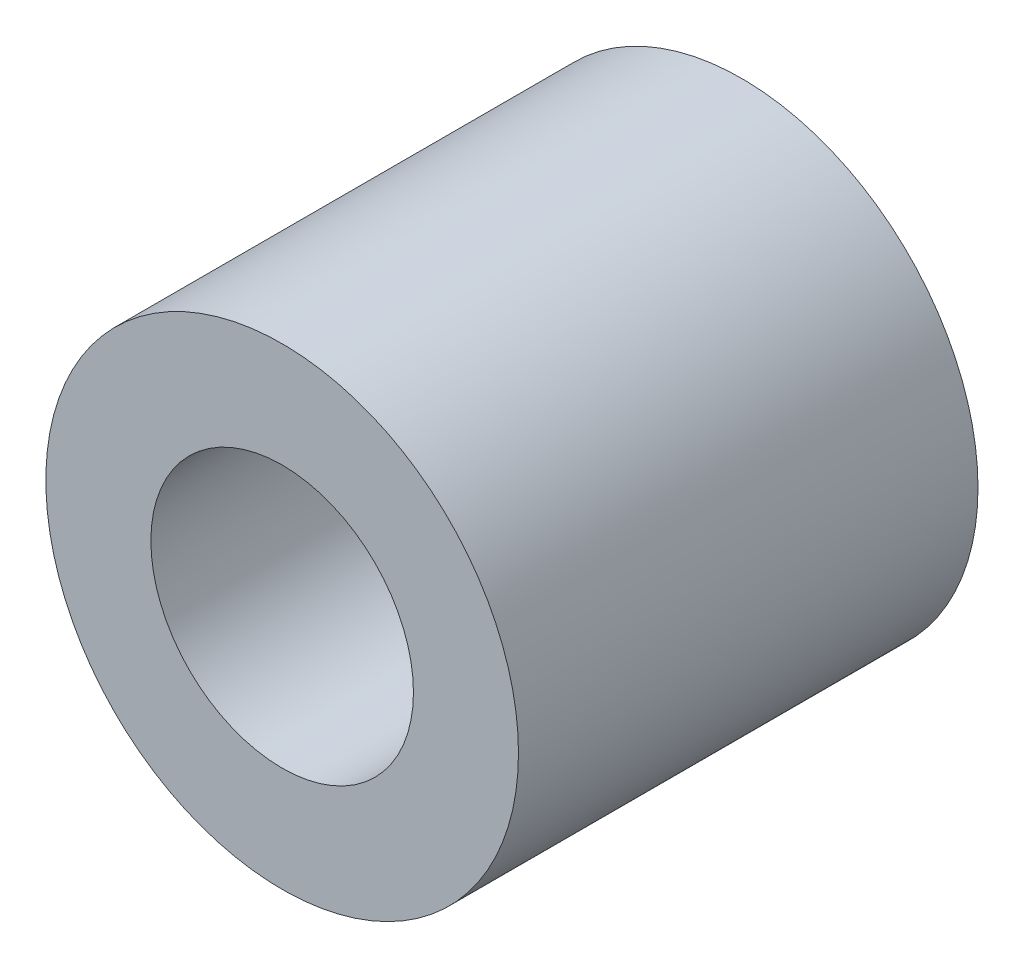
ISO-10303-21;
HEADER;
FILE_DESCRIPTION(('STEP AP214'),'2;1');
FILE_NAME('part.step','',(''),(''),'','','');
FILE_SCHEMA(('AUTOMOTIVE_DESIGN { 1 0 10303 214 1 1 1 1 }'));
ENDSEC;
DATA;
#1=APPLICATION_CONTEXT('core data for automotive mechanical design processes');
#2=APPLICATION_PROTOCOL_DEFINITION('international standard','automotive_design',2000,#1);
#3=PRODUCT_CONTEXT('',#1,'mechanical');
#4=PRODUCT('Part','Part','',(#3));
#5=PRODUCT_RELATED_PRODUCT_CATEGORY('part','',(#4));
#6=PRODUCT_DEFINITION_FORMATION('','',#4);
#7=PRODUCT_DEFINITION_CONTEXT('part definition',#1,'design');
#8=PRODUCT_DEFINITION('design','',#6,#7);
#9=PRODUCT_DEFINITION_SHAPE('','',#8);
#10=(LENGTH_UNIT() NAMED_UNIT(*) SI_UNIT(.MILLI.,.METRE.));
#11=(NAMED_UNIT(*) PLANE_ANGLE_UNIT() SI_UNIT($,.RADIAN.));
#12=(NAMED_UNIT(*) SI_UNIT($,.STERADIAN.) SOLID_ANGLE_UNIT());
#13=UNCERTAINTY_MEASURE_WITH_UNIT(LENGTH_MEASURE(1.E-05),#10,'distance_accuracy_value','');
#14=(GEOMETRIC_REPRESENTATION_CONTEXT(3) GLOBAL_UNCERTAINTY_ASSIGNED_CONTEXT((#13)) GLOBAL_UNIT_ASSIGNED_CONTEXT((#10,
#11,#12)) REPRESENTATION_CONTEXT('',''));
#15=CARTESIAN_POINT('',(0.,0.,0.));
#16=DIRECTION('',(0.,0.,1.));
#17=DIRECTION('',(1.,0.,0.));
#18=AXIS2_PLACEMENT_3D('',#15,#16,#17);
#19=CARTESIAN_POINT('',(0.,0.,17.5));
#20=DIRECTION('',(0.,0.,1.));
#21=DIRECTION('',(1.,0.,0.));
#22=AXIS2_PLACEMENT_3D('',#19,#20,#21);
#23=PLANE('',#22);
#24=CARTESIAN_POINT('',(0.,0.,17.5));
#25=DIRECTION('',(0.,0.,1.));
#26=DIRECTION('',(1.,0.,0.));
#27=AXIS2_PLACEMENT_3D('',#24,#25,#26);
#28=CIRCLE('',#27,9.);
#29=CARTESIAN_POINT('',(9.,0.,17.5));
#30=VERTEX_POINT('',#29);
#31=EDGE_CURVE('E10',#30,#30,#28,.T.);
#32=ORIENTED_EDGE('',*,*,#31,.T.);
#33=EDGE_LOOP('',(#32));
#34=FACE_BOUND('',#33,.T.);
#35=CARTESIAN_POINT('',(0.,0.,17.5));
#36=DIRECTION('',(0.,0.,1.));
#37=DIRECTION('',(1.,0.,0.));
#38=AXIS2_PLACEMENT_3D('',#35,#36,#37);
#39=CIRCLE('',#38,5.);
#40=CARTESIAN_POINT('',(5.,0.,17.5));
#41=VERTEX_POINT('',#40);
#42=EDGE_CURVE('E50',#41,#41,#39,.T.);
#43=ORIENTED_EDGE('',*,*,#42,.F.);
#44=EDGE_LOOP('',(#43));
#45=FACE_BOUND('',#44,.T.);
#46=ADVANCED_FACE('F37',(#34,#45),#23,.T.);
#47=CARTESIAN_POINT('',(0.,0.,0.));
#48=DIRECTION('',(0.,0.,1.));
#49=DIRECTION('',(1.,0.,0.));
#50=AXIS2_PLACEMENT_3D('',#47,#48,#49);
#51=PLANE('',#50);
#52=CARTESIAN_POINT('',(0.,0.,0.));
#53=DIRECTION('',(0.,0.,1.));
#54=DIRECTION('',(1.,0.,0.));
#55=AXIS2_PLACEMENT_3D('',#52,#53,#54);
#56=CIRCLE('',#55,9.);
#57=CARTESIAN_POINT('',(9.,0.,0.));
#58=VERTEX_POINT('',#57);
#59=EDGE_CURVE('E41',#58,#58,#56,.T.);
#60=ORIENTED_EDGE('',*,*,#59,.F.);
#61=EDGE_LOOP('',(#60));
#62=FACE_BOUND('',#61,.T.);
#63=CARTESIAN_POINT('',(0.,0.,0.));
#64=DIRECTION('',(0.,0.,1.));
#65=DIRECTION('',(1.,0.,0.));
#66=AXIS2_PLACEMENT_3D('',#63,#64,#65);
#67=CIRCLE('',#66,5.);
#68=CARTESIAN_POINT('',(5.,0.,0.));
#69=VERTEX_POINT('',#68);
#70=EDGE_CURVE('E52',#69,#69,#67,.T.);
#71=ORIENTED_EDGE('',*,*,#70,.T.);
#72=EDGE_LOOP('',(#71));
#73=FACE_BOUND('',#72,.T.);
#74=ADVANCED_FACE('F64',(#62,#73),#51,.F.);
#75=CARTESIAN_POINT('',(0.,0.,17.5));
#76=DIRECTION('',(0.,0.,-1.));
#77=DIRECTION('',(-1.,0.,0.));
#78=AXIS2_PLACEMENT_3D('',#75,#76,#77);
#79=CYLINDRICAL_SURFACE('',#78,9.);
#80=ORIENTED_EDGE('',*,*,#31,.F.);
#81=EDGE_LOOP('',(#80));
#82=FACE_BOUND('',#81,.T.);
#83=ORIENTED_EDGE('',*,*,#59,.T.);
#84=EDGE_LOOP('',(#83));
#85=FACE_BOUND('',#84,.T.);
#86=ADVANCED_FACE('F39',(#82,#85),#79,.T.);
#87=CARTESIAN_POINT('',(0.,0.,17.5));
#88=DIRECTION('',(0.,0.,-1.));
#89=DIRECTION('',(-1.,0.,0.));
#90=AXIS2_PLACEMENT_3D('',#87,#88,#89);
#91=CYLINDRICAL_SURFACE('',#90,5.);
#92=ORIENTED_EDGE('',*,*,#42,.T.);
#93=EDGE_LOOP('',(#92));
#94=FACE_BOUND('',#93,.T.);
#95=ORIENTED_EDGE('',*,*,#70,.F.);
#96=EDGE_LOOP('',(#95));
#97=FACE_BOUND('',#96,.T.);
#98=ADVANCED_FACE('F60',(#94,#97),#91,.F.);
#99=CLOSED_SHELL('',(#46,#74,#86,#98));
#100=MANIFOLD_SOLID_BREP('B2',#99);
#101=ADVANCED_BREP_SHAPE_REPRESENTATION('',(#18,#100),#14);
#102=SHAPE_DEFINITION_REPRESENTATION(#9,#101);
ENDSEC;
END-ISO-10303-21;
